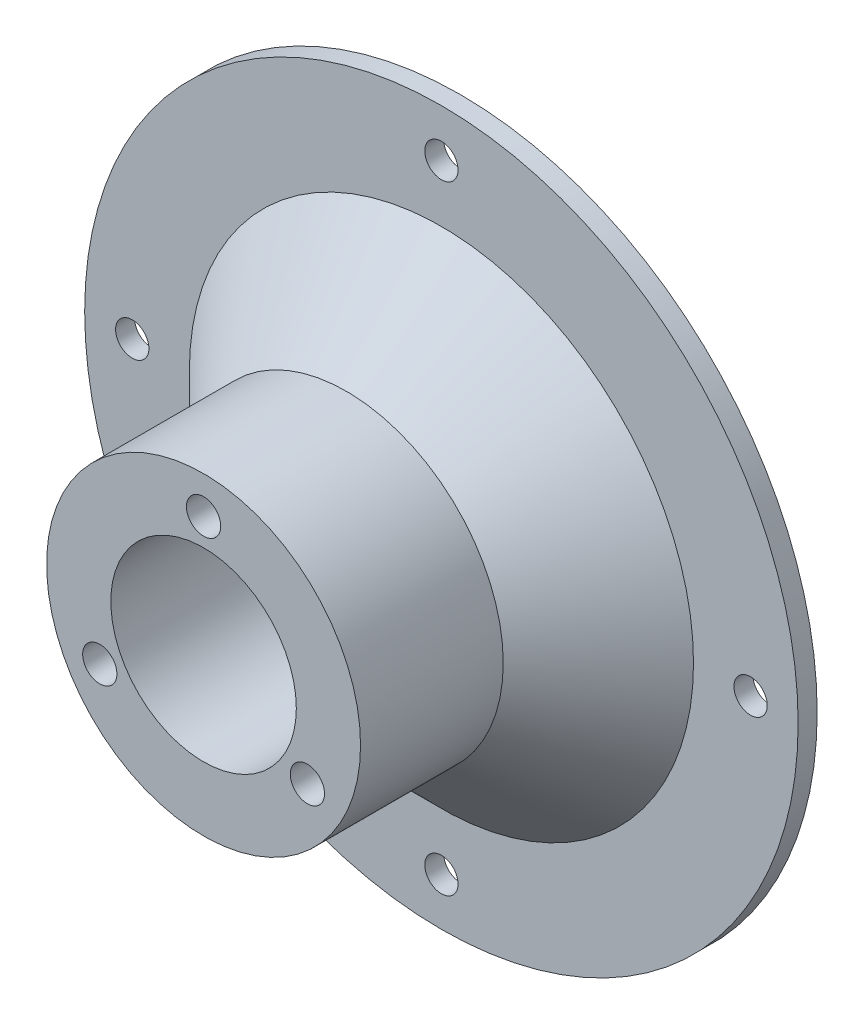
ISO-10303-21;
HEADER;
FILE_DESCRIPTION(('STEP AP214'),'2;1');
FILE_NAME('part.step','',(''),(''),'','','');
FILE_SCHEMA(('AUTOMOTIVE_DESIGN { 1 0 10303 214 1 1 1 1 }'));
ENDSEC;
DATA;
#1=APPLICATION_CONTEXT('core data for automotive mechanical design processes');
#2=APPLICATION_PROTOCOL_DEFINITION('international standard','automotive_design',2000,#1);
#3=PRODUCT_CONTEXT('',#1,'mechanical');
#4=PRODUCT('Part','Part','',(#3));
#5=PRODUCT_RELATED_PRODUCT_CATEGORY('part','',(#4));
#6=PRODUCT_DEFINITION_FORMATION('','',#4);
#7=PRODUCT_DEFINITION_CONTEXT('part definition',#1,'design');
#8=PRODUCT_DEFINITION('design','',#6,#7);
#9=PRODUCT_DEFINITION_SHAPE('','',#8);
#10=(LENGTH_UNIT() NAMED_UNIT(*) SI_UNIT(.MILLI.,.METRE.));
#11=(NAMED_UNIT(*) PLANE_ANGLE_UNIT() SI_UNIT($,.RADIAN.));
#12=(NAMED_UNIT(*) SI_UNIT($,.STERADIAN.) SOLID_ANGLE_UNIT());
#13=UNCERTAINTY_MEASURE_WITH_UNIT(LENGTH_MEASURE(1.E-05),#10,'distance_accuracy_value','');
#14=(GEOMETRIC_REPRESENTATION_CONTEXT(3) GLOBAL_UNCERTAINTY_ASSIGNED_CONTEXT((#13)) GLOBAL_UNIT_ASSIGNED_CONTEXT((#10,
#11,#12)) REPRESENTATION_CONTEXT('',''));
#15=CARTESIAN_POINT('',(0.,0.,0.));
#16=DIRECTION('',(0.,0.,1.));
#17=DIRECTION('',(1.,0.,0.));
#18=AXIS2_PLACEMENT_3D('',#15,#16,#17);
#19=CARTESIAN_POINT('',(0.,0.,2.));
#20=DIRECTION('',(0.,0.,-1.));
#21=DIRECTION('',(-1.,0.,0.));
#22=AXIS2_PLACEMENT_3D('',#19,#20,#21);
#23=CYLINDRICAL_SURFACE('',#22,37.5);
#24=CARTESIAN_POINT('',(0.,0.,2.));
#25=DIRECTION('',(0.,0.,1.));
#26=DIRECTION('',(1.,0.,0.));
#27=AXIS2_PLACEMENT_3D('',#24,#25,#26);
#28=CIRCLE('',#27,37.5);
#29=CARTESIAN_POINT('',(37.5,0.,2.));
#30=VERTEX_POINT('',#29);
#31=EDGE_CURVE('E55',#30,#30,#28,.T.);
#32=ORIENTED_EDGE('',*,*,#31,.F.);
#33=EDGE_LOOP('',(#32));
#34=FACE_BOUND('',#33,.T.);
#35=CARTESIAN_POINT('',(0.,0.,0.));
#36=DIRECTION('',(0.,0.,1.));
#37=DIRECTION('',(1.,0.,0.));
#38=AXIS2_PLACEMENT_3D('',#35,#36,#37);
#39=CIRCLE('',#38,37.5);
#40=CARTESIAN_POINT('',(37.5,0.,0.));
#41=VERTEX_POINT('',#40);
#42=EDGE_CURVE('E60',#41,#41,#39,.T.);
#43=ORIENTED_EDGE('',*,*,#42,.T.);
#44=EDGE_LOOP('',(#43));
#45=FACE_BOUND('',#44,.T.);
#46=ADVANCED_FACE('F41',(#34,#45),#23,.T.);
#47=CARTESIAN_POINT('',(0.,0.,2.));
#48=DIRECTION('',(0.,0.,1.));
#49=DIRECTION('',(1.,0.,0.));
#50=AXIS2_PLACEMENT_3D('',#47,#48,#49);
#51=PLANE('',#50);
#52=CARTESIAN_POINT('',(0.,0.,2.));
#53=DIRECTION('',(0.,0.,1.));
#54=DIRECTION('',(1.,0.,0.));
#55=AXIS2_PLACEMENT_3D('',#52,#53,#54);
#56=CIRCLE('',#55,26.5);
#57=CARTESIAN_POINT('',(26.5,0.,2.));
#58=VERTEX_POINT('',#57);
#59=EDGE_CURVE('E10',#58,#58,#56,.F.);
#60=ORIENTED_EDGE('',*,*,#59,.T.);
#61=EDGE_LOOP('',(#60));
#62=FACE_BOUND('',#61,.T.);
#63=CARTESIAN_POINT('',(0.,32.5,2.));
#64=DIRECTION('',(0.,0.,1.));
#65=DIRECTION('',(1.,0.,0.));
#66=AXIS2_PLACEMENT_3D('',#63,#64,#65);
#67=CIRCLE('',#66,1.75);
#68=CARTESIAN_POINT('',(1.75,32.5,2.));
#69=VERTEX_POINT('',#68);
#70=EDGE_CURVE('E89',#69,#69,#67,.T.);
#71=ORIENTED_EDGE('',*,*,#70,.F.);
#72=EDGE_LOOP('',(#71));
#73=FACE_BOUND('',#72,.T.);
#74=CARTESIAN_POINT('',(32.5,0.,2.));
#75=DIRECTION('',(0.,0.,1.));
#76=DIRECTION('',(1.,0.,0.));
#77=AXIS2_PLACEMENT_3D('',#74,#75,#76);
#78=CIRCLE('',#77,1.75000000000011);
#79=CARTESIAN_POINT('',(34.2500000000001,0.,2.));
#80=VERTEX_POINT('',#79);
#81=EDGE_CURVE('E81',#80,#80,#78,.T.);
#82=ORIENTED_EDGE('',*,*,#81,.F.);
#83=EDGE_LOOP('',(#82));
#84=FACE_BOUND('',#83,.T.);
#85=CARTESIAN_POINT('',(0.,-32.5,2.));
#86=DIRECTION('',(0.,0.,1.));
#87=DIRECTION('',(1.,0.,0.));
#88=AXIS2_PLACEMENT_3D('',#85,#86,#87);
#89=CIRCLE('',#88,1.75000000000022);
#90=CARTESIAN_POINT('',(1.75000000000022,-32.5,2.));
#91=VERTEX_POINT('',#90);
#92=EDGE_CURVE('E71',#91,#91,#89,.T.);
#93=ORIENTED_EDGE('',*,*,#92,.F.);
#94=EDGE_LOOP('',(#93));
#95=FACE_BOUND('',#94,.T.);
#96=CARTESIAN_POINT('',(-32.5,0.,2.));
#97=DIRECTION('',(0.,0.,1.));
#98=DIRECTION('',(1.,0.,0.));
#99=AXIS2_PLACEMENT_3D('',#96,#97,#98);
#100=CIRCLE('',#99,1.75000000000033);
#101=CARTESIAN_POINT('',(-30.7499999999997,0.,2.));
#102=VERTEX_POINT('',#101);
#103=EDGE_CURVE('E72',#102,#102,#100,.T.);
#104=ORIENTED_EDGE('',*,*,#103,.F.);
#105=EDGE_LOOP('',(#104));
#106=FACE_BOUND('',#105,.T.);
#107=ORIENTED_EDGE('',*,*,#31,.T.);
#108=EDGE_LOOP('',(#107));
#109=FACE_BOUND('',#108,.T.);
#110=ADVANCED_FACE('F158',(#62,#73,#84,#95,#106,#109),#51,.T.);
#111=CARTESIAN_POINT('',(0.,0.,0.));
#112=DIRECTION('',(0.,0.,1.));
#113=DIRECTION('',(1.,0.,0.));
#114=AXIS2_PLACEMENT_3D('',#111,#112,#113);
#115=PLANE('',#114);
#116=CARTESIAN_POINT('',(-10.9119200876839,-6.3,0.));
#117=DIRECTION('',(0.,0.,1.));
#118=DIRECTION('',(1.,0.,0.));
#119=AXIS2_PLACEMENT_3D('',#116,#117,#118);
#120=CIRCLE('',#119,1.80000000000011);
#121=CARTESIAN_POINT('',(-9.11192008768381,-6.3,0.));
#122=VERTEX_POINT('',#121);
#123=EDGE_CURVE('E111',#122,#122,#120,.F.);
#124=ORIENTED_EDGE('',*,*,#123,.F.);
#125=EDGE_LOOP('',(#124));
#126=FACE_BOUND('',#125,.T.);
#127=CARTESIAN_POINT('',(10.9119200876839,-6.3,0.));
#128=DIRECTION('',(0.,0.,1.));
#129=DIRECTION('',(1.,0.,0.));
#130=AXIS2_PLACEMENT_3D('',#127,#128,#129);
#131=CIRCLE('',#130,1.80000000000006);
#132=CARTESIAN_POINT('',(12.711920087684,-6.3,0.));
#133=VERTEX_POINT('',#132);
#134=EDGE_CURVE('E120',#133,#133,#131,.F.);
#135=ORIENTED_EDGE('',*,*,#134,.F.);
#136=EDGE_LOOP('',(#135));
#137=FACE_BOUND('',#136,.T.);
#138=CARTESIAN_POINT('',(0.,12.6,0.));
#139=DIRECTION('',(0.,0.,1.));
#140=DIRECTION('',(1.,0.,0.));
#141=AXIS2_PLACEMENT_3D('',#138,#139,#140);
#142=CIRCLE('',#141,1.8);
#143=CARTESIAN_POINT('',(1.8,12.6,0.));
#144=VERTEX_POINT('',#143);
#145=EDGE_CURVE('E110',#144,#144,#142,.F.);
#146=ORIENTED_EDGE('',*,*,#145,.F.);
#147=EDGE_LOOP('',(#146));
#148=FACE_BOUND('',#147,.T.);
#149=CARTESIAN_POINT('',(0.,0.,0.));
#150=DIRECTION('',(0.,0.,1.));
#151=DIRECTION('',(1.,0.,0.));
#152=AXIS2_PLACEMENT_3D('',#149,#150,#151);
#153=CIRCLE('',#152,9.75);
#154=CARTESIAN_POINT('',(9.75,0.,0.));
#155=VERTEX_POINT('',#154);
#156=EDGE_CURVE('E102',#155,#155,#153,.F.);
#157=ORIENTED_EDGE('',*,*,#156,.F.);
#158=EDGE_LOOP('',(#157));
#159=FACE_BOUND('',#158,.T.);
#160=CARTESIAN_POINT('',(0.,32.5,0.));
#161=DIRECTION('',(0.,0.,1.));
#162=DIRECTION('',(1.,0.,0.));
#163=AXIS2_PLACEMENT_3D('',#160,#161,#162);
#164=CIRCLE('',#163,1.75);
#165=CARTESIAN_POINT('',(1.75,32.5,0.));
#166=VERTEX_POINT('',#165);
#167=EDGE_CURVE('E65',#166,#166,#164,.F.);
#168=ORIENTED_EDGE('',*,*,#167,.F.);
#169=EDGE_LOOP('',(#168));
#170=FACE_BOUND('',#169,.T.);
#171=CARTESIAN_POINT('',(32.5,0.,0.));
#172=DIRECTION('',(0.,0.,1.));
#173=DIRECTION('',(1.,0.,0.));
#174=AXIS2_PLACEMENT_3D('',#171,#172,#173);
#175=CIRCLE('',#174,1.75000000000011);
#176=CARTESIAN_POINT('',(34.2500000000001,0.,0.));
#177=VERTEX_POINT('',#176);
#178=EDGE_CURVE('E85',#177,#177,#175,.F.);
#179=ORIENTED_EDGE('',*,*,#178,.F.);
#180=EDGE_LOOP('',(#179));
#181=FACE_BOUND('',#180,.T.);
#182=CARTESIAN_POINT('',(0.,-32.5,0.));
#183=DIRECTION('',(0.,0.,1.));
#184=DIRECTION('',(1.,0.,0.));
#185=AXIS2_PLACEMENT_3D('',#182,#183,#184);
#186=CIRCLE('',#185,1.75000000000022);
#187=CARTESIAN_POINT('',(1.75000000000022,-32.5,0.));
#188=VERTEX_POINT('',#187);
#189=EDGE_CURVE('E77',#188,#188,#186,.F.);
#190=ORIENTED_EDGE('',*,*,#189,.F.);
#191=EDGE_LOOP('',(#190));
#192=FACE_BOUND('',#191,.T.);
#193=CARTESIAN_POINT('',(-32.5,0.,0.));
#194=DIRECTION('',(0.,0.,1.));
#195=DIRECTION('',(1.,0.,0.));
#196=AXIS2_PLACEMENT_3D('',#193,#194,#195);
#197=CIRCLE('',#196,1.75000000000033);
#198=CARTESIAN_POINT('',(-30.7499999999997,0.,0.));
#199=VERTEX_POINT('',#198);
#200=EDGE_CURVE('E67',#199,#199,#197,.F.);
#201=ORIENTED_EDGE('',*,*,#200,.F.);
#202=EDGE_LOOP('',(#201));
#203=FACE_BOUND('',#202,.T.);
#204=ORIENTED_EDGE('',*,*,#42,.F.);
#205=EDGE_LOOP('',(#204));
#206=FACE_BOUND('',#205,.T.);
#207=ADVANCED_FACE('F163',(#126,#137,#148,#159,#170,#181,#192,#203,#206),#115,.F.);
#208=CARTESIAN_POINT('',(-32.5,0.,-4.94974746830677));
#209=DIRECTION('',(0.,0.,1.));
#210=DIRECTION('',(1.,0.,0.));
#211=AXIS2_PLACEMENT_3D('',#208,#209,#210);
#212=CYLINDRICAL_SURFACE('',#211,1.75000000000033);
#213=ORIENTED_EDGE('',*,*,#200,.T.);
#214=EDGE_LOOP('',(#213));
#215=FACE_BOUND('',#214,.T.);
#216=ORIENTED_EDGE('',*,*,#103,.T.);
#217=EDGE_LOOP('',(#216));
#218=FACE_BOUND('',#217,.T.);
#219=ADVANCED_FACE('F169',(#215,#218),#212,.F.);
#220=CARTESIAN_POINT('',(0.,-32.5,-4.94974746830677));
#221=DIRECTION('',(0.,0.,1.));
#222=DIRECTION('',(1.,0.,0.));
#223=AXIS2_PLACEMENT_3D('',#220,#221,#222);
#224=CYLINDRICAL_SURFACE('',#223,1.75000000000022);
#225=ORIENTED_EDGE('',*,*,#189,.T.);
#226=EDGE_LOOP('',(#225));
#227=FACE_BOUND('',#226,.T.);
#228=ORIENTED_EDGE('',*,*,#92,.T.);
#229=EDGE_LOOP('',(#228));
#230=FACE_BOUND('',#229,.T.);
#231=ADVANCED_FACE('F174',(#227,#230),#224,.F.);
#232=CARTESIAN_POINT('',(32.5,0.,-4.94974746830677));
#233=DIRECTION('',(0.,0.,1.));
#234=DIRECTION('',(1.,0.,0.));
#235=AXIS2_PLACEMENT_3D('',#232,#233,#234);
#236=CYLINDRICAL_SURFACE('',#235,1.75000000000011);
#237=ORIENTED_EDGE('',*,*,#178,.T.);
#238=EDGE_LOOP('',(#237));
#239=FACE_BOUND('',#238,.T.);
#240=ORIENTED_EDGE('',*,*,#81,.T.);
#241=EDGE_LOOP('',(#240));
#242=FACE_BOUND('',#241,.T.);
#243=ADVANCED_FACE('F154',(#239,#242),#236,.F.);
#244=CARTESIAN_POINT('',(0.,32.5,-4.94974746830677));
#245=DIRECTION('',(0.,0.,1.));
#246=DIRECTION('',(1.,0.,0.));
#247=AXIS2_PLACEMENT_3D('',#244,#245,#246);
#248=CYLINDRICAL_SURFACE('',#247,1.75);
#249=ORIENTED_EDGE('',*,*,#167,.T.);
#250=EDGE_LOOP('',(#249));
#251=FACE_BOUND('',#250,.T.);
#252=ORIENTED_EDGE('',*,*,#70,.T.);
#253=EDGE_LOOP('',(#252));
#254=FACE_BOUND('',#253,.T.);
#255=ADVANCED_FACE('F149',(#251,#254),#248,.F.);
#256=CARTESIAN_POINT('',(0.,0.,27.));
#257=DIRECTION('',(0.,0.,-1.));
#258=DIRECTION('',(-1.,0.,0.));
#259=AXIS2_PLACEMENT_3D('',#256,#257,#258);
#260=CYLINDRICAL_SURFACE('',#259,16.5);
#261=CARTESIAN_POINT('',(0.,0.,12.0000000000001));
#262=DIRECTION('',(0.,0.,1.));
#263=DIRECTION('',(1.,0.,0.));
#264=AXIS2_PLACEMENT_3D('',#261,#262,#263);
#265=CIRCLE('',#264,16.5);
#266=CARTESIAN_POINT('',(16.5,0.,12.0000000000001));
#267=VERTEX_POINT('',#266);
#268=EDGE_CURVE('E50',#267,#267,#265,.T.);
#269=ORIENTED_EDGE('',*,*,#268,.T.);
#270=EDGE_LOOP('',(#269));
#271=FACE_BOUND('',#270,.T.);
#272=CARTESIAN_POINT('',(0.,0.,27.));
#273=DIRECTION('',(0.,0.,1.));
#274=DIRECTION('',(1.,0.,0.));
#275=AXIS2_PLACEMENT_3D('',#272,#273,#274);
#276=CIRCLE('',#275,16.5);
#277=CARTESIAN_POINT('',(16.5,0.,27.));
#278=VERTEX_POINT('',#277);
#279=EDGE_CURVE('E76',#278,#278,#276,.T.);
#280=ORIENTED_EDGE('',*,*,#279,.F.);
#281=EDGE_LOOP('',(#280));
#282=FACE_BOUND('',#281,.T.);
#283=ADVANCED_FACE('F141',(#271,#282),#260,.T.);
#284=CARTESIAN_POINT('',(0.,0.,27.));
#285=DIRECTION('',(0.,0.,1.));
#286=DIRECTION('',(1.,0.,0.));
#287=AXIS2_PLACEMENT_3D('',#284,#285,#286);
#288=PLANE('',#287);
#289=CARTESIAN_POINT('',(-10.9119200876839,-6.3,27.));
#290=DIRECTION('',(0.,0.,1.));
#291=DIRECTION('',(1.,0.,0.));
#292=AXIS2_PLACEMENT_3D('',#289,#290,#291);
#293=CIRCLE('',#292,1.80000000000011);
#294=CARTESIAN_POINT('',(-9.11192008768381,-6.3,27.));
#295=VERTEX_POINT('',#294);
#296=EDGE_CURVE('E116',#295,#295,#293,.T.);
#297=ORIENTED_EDGE('',*,*,#296,.F.);
#298=EDGE_LOOP('',(#297));
#299=FACE_BOUND('',#298,.T.);
#300=CARTESIAN_POINT('',(10.9119200876839,-6.3,27.));
#301=DIRECTION('',(0.,0.,1.));
#302=DIRECTION('',(1.,0.,0.));
#303=AXIS2_PLACEMENT_3D('',#300,#301,#302);
#304=CIRCLE('',#303,1.80000000000006);
#305=CARTESIAN_POINT('',(12.711920087684,-6.3,27.));
#306=VERTEX_POINT('',#305);
#307=EDGE_CURVE('E115',#306,#306,#304,.T.);
#308=ORIENTED_EDGE('',*,*,#307,.F.);
#309=EDGE_LOOP('',(#308));
#310=FACE_BOUND('',#309,.T.);
#311=CARTESIAN_POINT('',(0.,12.6,27.));
#312=DIRECTION('',(0.,0.,1.));
#313=DIRECTION('',(1.,0.,0.));
#314=AXIS2_PLACEMENT_3D('',#311,#312,#313);
#315=CIRCLE('',#314,1.8);
#316=CARTESIAN_POINT('',(1.8,12.6,27.));
#317=VERTEX_POINT('',#316);
#318=EDGE_CURVE('E124',#317,#317,#315,.T.);
#319=ORIENTED_EDGE('',*,*,#318,.F.);
#320=EDGE_LOOP('',(#319));
#321=FACE_BOUND('',#320,.T.);
#322=CARTESIAN_POINT('',(0.,0.,27.));
#323=DIRECTION('',(0.,0.,1.));
#324=DIRECTION('',(1.,0.,0.));
#325=AXIS2_PLACEMENT_3D('',#322,#323,#324);
#326=CIRCLE('',#325,9.75);
#327=CARTESIAN_POINT('',(9.75,0.,27.));
#328=VERTEX_POINT('',#327);
#329=EDGE_CURVE('E106',#328,#328,#326,.T.);
#330=ORIENTED_EDGE('',*,*,#329,.F.);
#331=EDGE_LOOP('',(#330));
#332=FACE_BOUND('',#331,.T.);
#333=ORIENTED_EDGE('',*,*,#279,.T.);
#334=EDGE_LOOP('',(#333));
#335=FACE_BOUND('',#334,.T.);
#336=ADVANCED_FACE('F137',(#299,#310,#321,#332,#335),#288,.T.);
#337=CARTESIAN_POINT('',(0.,0.,-27.5771644662754));
#338=DIRECTION('',(0.,0.,1.));
#339=DIRECTION('',(1.,0.,0.));
#340=AXIS2_PLACEMENT_3D('',#337,#338,#339);
#341=CYLINDRICAL_SURFACE('',#340,9.75);
#342=ORIENTED_EDGE('',*,*,#156,.T.);
#343=EDGE_LOOP('',(#342));
#344=FACE_BOUND('',#343,.T.);
#345=ORIENTED_EDGE('',*,*,#329,.T.);
#346=EDGE_LOOP('',(#345));
#347=FACE_BOUND('',#346,.T.);
#348=ADVANCED_FACE('F140',(#344,#347),#341,.F.);
#349=CARTESIAN_POINT('',(0.,12.6,-27.5771644662754));
#350=DIRECTION('',(0.,0.,1.));
#351=DIRECTION('',(1.,0.,0.));
#352=AXIS2_PLACEMENT_3D('',#349,#350,#351);
#353=CYLINDRICAL_SURFACE('',#352,1.8);
#354=ORIENTED_EDGE('',*,*,#145,.T.);
#355=EDGE_LOOP('',(#354));
#356=FACE_BOUND('',#355,.T.);
#357=ORIENTED_EDGE('',*,*,#318,.T.);
#358=EDGE_LOOP('',(#357));
#359=FACE_BOUND('',#358,.T.);
#360=ADVANCED_FACE('F135',(#356,#359),#353,.F.);
#361=CARTESIAN_POINT('',(10.9119200876839,-6.3,-27.5771644662754));
#362=DIRECTION('',(0.,0.,1.));
#363=DIRECTION('',(1.,0.,0.));
#364=AXIS2_PLACEMENT_3D('',#361,#362,#363);
#365=CYLINDRICAL_SURFACE('',#364,1.80000000000006);
#366=ORIENTED_EDGE('',*,*,#134,.T.);
#367=EDGE_LOOP('',(#366));
#368=FACE_BOUND('',#367,.T.);
#369=ORIENTED_EDGE('',*,*,#307,.T.);
#370=EDGE_LOOP('',(#369));
#371=FACE_BOUND('',#370,.T.);
#372=ADVANCED_FACE('F240',(#368,#371),#365,.F.);
#373=CARTESIAN_POINT('',(-10.9119200876839,-6.3,-27.5771644662754));
#374=DIRECTION('',(0.,0.,1.));
#375=DIRECTION('',(1.,0.,0.));
#376=AXIS2_PLACEMENT_3D('',#373,#374,#375);
#377=CYLINDRICAL_SURFACE('',#376,1.80000000000011);
#378=ORIENTED_EDGE('',*,*,#123,.T.);
#379=EDGE_LOOP('',(#378));
#380=FACE_BOUND('',#379,.T.);
#381=ORIENTED_EDGE('',*,*,#296,.T.);
#382=EDGE_LOOP('',(#381));
#383=FACE_BOUND('',#382,.T.);
#384=ADVANCED_FACE('F250',(#380,#383),#377,.F.);
#385=CARTESIAN_POINT('',(0.,0.,12.0000000000001));
#386=DIRECTION('',(0.,0.,-1.));
#387=DIRECTION('',(-1.,0.,0.));
#388=AXIS2_PLACEMENT_3D('',#385,#386,#387);
#389=CONICAL_SURFACE('',#388,16.5,0.785398163397444);
#390=ORIENTED_EDGE('',*,*,#59,.F.);
#391=EDGE_LOOP('',(#390));
#392=FACE_BOUND('',#391,.T.);
#393=ORIENTED_EDGE('',*,*,#268,.F.);
#394=EDGE_LOOP('',(#393));
#395=FACE_BOUND('',#394,.T.);
#396=ADVANCED_FACE('F44',(#392,#395),#389,.T.);
#397=CLOSED_SHELL('',(#46,#110,#207,#219,#231,#243,#255,#283,#336,#348,#360,#372,#384,#396));
#398=MANIFOLD_SOLID_BREP('B2',#397);
#399=ADVANCED_BREP_SHAPE_REPRESENTATION('',(#18,#398),#14);
#400=SHAPE_DEFINITION_REPRESENTATION(#9,#399);
ENDSEC;
END-ISO-10303-21;
